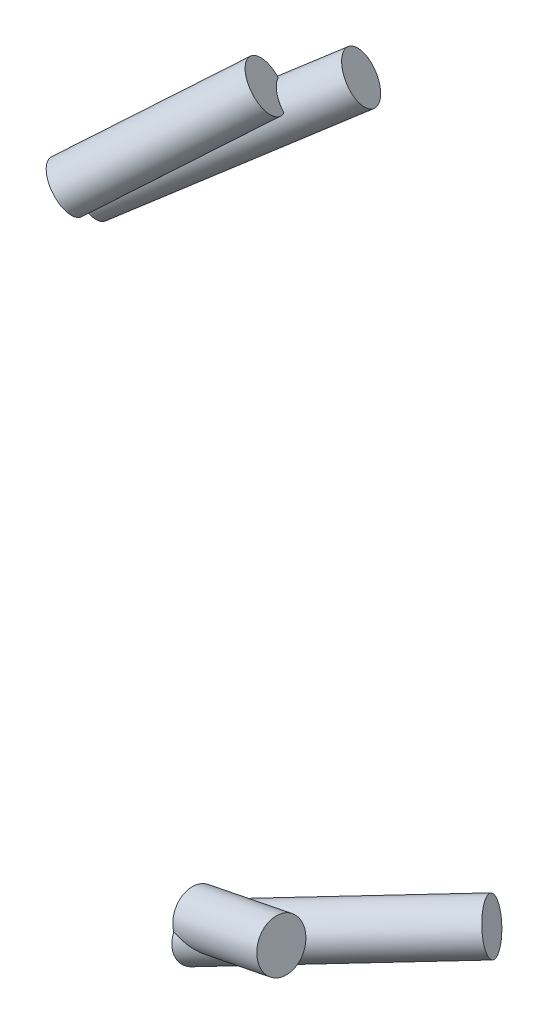
ISO-10303-21;
HEADER;
FILE_DESCRIPTION(('STEP AP214'),'2;1');
FILE_NAME('part.step','',(''),(''),'','','');
FILE_SCHEMA(('AUTOMOTIVE_DESIGN { 1 0 10303 214 1 1 1 1 }'));
ENDSEC;
DATA;
#1=APPLICATION_CONTEXT('core data for automotive mechanical design processes');
#2=APPLICATION_PROTOCOL_DEFINITION('international standard','automotive_design',2000,#1);
#3=PRODUCT_CONTEXT('',#1,'mechanical');
#4=PRODUCT('Part','Part','',(#3));
#5=PRODUCT_RELATED_PRODUCT_CATEGORY('part','',(#4));
#6=PRODUCT_DEFINITION_FORMATION('','',#4);
#7=PRODUCT_DEFINITION_CONTEXT('part definition',#1,'design');
#8=PRODUCT_DEFINITION('design','',#6,#7);
#9=PRODUCT_DEFINITION_SHAPE('','',#8);
#10=(LENGTH_UNIT() NAMED_UNIT(*) SI_UNIT(.MILLI.,.METRE.));
#11=(NAMED_UNIT(*) PLANE_ANGLE_UNIT() SI_UNIT($,.RADIAN.));
#12=(NAMED_UNIT(*) SI_UNIT($,.STERADIAN.) SOLID_ANGLE_UNIT());
#13=UNCERTAINTY_MEASURE_WITH_UNIT(LENGTH_MEASURE(1.E-05),#10,'distance_accuracy_value','');
#14=(GEOMETRIC_REPRESENTATION_CONTEXT(3) GLOBAL_UNCERTAINTY_ASSIGNED_CONTEXT((#13)) GLOBAL_UNIT_ASSIGNED_CONTEXT((#10,
#11,#12)) REPRESENTATION_CONTEXT('',''));
#15=CARTESIAN_POINT('',(0.,0.,0.));
#16=DIRECTION('',(0.,0.,1.));
#17=DIRECTION('',(1.,0.,0.));
#18=AXIS2_PLACEMENT_3D('',#15,#16,#17);
#19=CARTESIAN_POINT('',(205.492137,1315.8651,-290.325886));
#20=DIRECTION('',(0.707634787239325,0.549255984730346,-0.444489449961023));
#21=DIRECTION('',(-0.61315666717658,0.789961329114856,0.));
#22=AXIS2_PLACEMENT_3D('',#19,#20,#21);
#23=PLANE('',#22);
#24=CARTESIAN_POINT('',(205.492137,1315.8651,-290.325886));
#25=DIRECTION('',(0.707634787239325,0.549255984730346,-0.444489449961023));
#26=DIRECTION('',(-0.61315666717658,0.789961329114856,0.));
#27=AXIS2_PLACEMENT_3D('',#24,#25,#26);
#28=CIRCLE('',#27,6.99999999999999);
#29=CARTESIAN_POINT('',(206.194755449757,1319.6769593374,-284.496987673051));
#30=VERTEX_POINT('',#29);
#31=CARTESIAN_POINT('',(202.755485993123,1321.66365056859,-287.517407306817));
#32=VERTEX_POINT('',#31);
#33=EDGE_CURVE('E134',#30,#32,#28,.T.);
#34=ORIENTED_EDGE('',*,*,#33,.F.);
#35=DIRECTION('',(-0.100374852290123,-0.544550619731773,-0.832700133047592));
#36=VECTOR('',#35,1.);
#37=CARTESIAN_POINT('',(206.541272310236,1321.55687215239,-281.622317083341));
#38=LINE('',#37,#36);
#39=CARTESIAN_POINT('',(205.838648344204,1317.74501781426,-287.451218014674));
#40=VERTEX_POINT('',#39);
#41=EDGE_CURVE('E98',#30,#40,#38,.T.);
#42=ORIENTED_EDGE('',*,*,#41,.T.);
#43=CARTESIAN_POINT('',(206.541274841578,1321.55686985828,-281.622315888227));
#44=DIRECTION('',(0.707634787239325,0.549255984730346,-0.444489449961023));
#45=DIRECTION('',(-0.699412537002649,0.633863144367682,-0.330211473598107));
#46=AXIS2_PLACEMENT_3D('',#43,#44,#45);
#47=ELLIPSE('',#46,7.01546166768687,6.99999999999999);
#48=EDGE_CURVE('E91',#32,#40,#47,.F.);
#49=ORIENTED_EDGE('',*,*,#48,.F.);
#50=EDGE_LOOP('',(#34,#42,#49));
#51=FACE_BOUND('',#50,.T.);
#52=ADVANCED_FACE('F77',(#51),#23,.F.);
#53=CARTESIAN_POINT('',(205.492137,1315.8651,-290.325886));
#54=DIRECTION('',(0.707634787239325,0.549255984730346,-0.444489449961022));
#55=DIRECTION('',(-0.61315666717658,0.789961329114855,0.));
#56=AXIS2_PLACEMENT_3D('',#53,#54,#55);
#57=CYLINDRICAL_SURFACE('',#56,6.99999999999999);
#58=CARTESIAN_POINT('',(254.064716,1353.56644,-320.835973));
#59=DIRECTION('',(0.707634787239325,0.549255984730346,-0.444489449961023));
#60=DIRECTION('',(-0.61315666717658,0.789961329114856,0.));
#61=AXIS2_PLACEMENT_3D('',#58,#59,#60);
#62=CIRCLE('',#61,6.99999999999999);
#63=CARTESIAN_POINT('',(249.772619329764,1359.0961693038,-320.835973));
#64=VERTEX_POINT('',#63);
#65=EDGE_CURVE('E129',#64,#64,#62,.T.);
#66=ORIENTED_EDGE('',*,*,#65,.F.);
#67=EDGE_LOOP('',(#66));
#68=FACE_BOUND('',#67,.T.);
#69=CARTESIAN_POINT('',(205.492137371155,1315.86510028809,-290.325886233135));
#70=DIRECTION('',(0.659665472961161,0.590105635574943,-0.465421102492807));
#71=DIRECTION('',(0.744826391054093,-0.596020101517078,0.299989476110258));
#72=AXIS2_PLACEMENT_3D('',#69,#70,#71);
#73=ELLIPSE('',#72,7.01546166768687,6.99999999999999);
#74=CARTESIAN_POINT('',(209.489651927909,1315.93474913126,-284.571693973106));
#75=VERTEX_POINT('',#74);
#76=EDGE_CURVE('E128',#30,#75,#73,.T.);
#77=ORIENTED_EDGE('',*,*,#76,.F.);
#78=ORIENTED_EDGE('',*,*,#33,.T.);
#79=CARTESIAN_POINT('',(202.755485993123,1321.66365056859,-287.517407306817));
#80=CARTESIAN_POINT('',(204.344051653858,1322.9554182,-288.636513844986));
#81=CARTESIAN_POINT('',(205.935139799472,1324.24504653722,-289.754508119233));
#82=CARTESIAN_POINT('',(209.122364978992,1326.82055794119,-291.987525919635));
#83=CARTESIAN_POINT('',(210.718501925398,1328.10644107211,-293.102549496665));
#84=CARTESIAN_POINT('',(214.476326811834,1331.12526901684,-295.719160696513));
#85=CARTESIAN_POINT('',(216.640119129513,1332.85690880127,-297.21923280162));
#86=CARTESIAN_POINT('',(220.976925093919,1336.31585293877,-300.211027993928));
#87=CARTESIAN_POINT('',(223.149938748426,1338.04315728817,-301.702751074083));
#88=CARTESIAN_POINT('',(227.505065974179,1341.4949660686,-304.676433931541));
#89=CARTESIAN_POINT('',(229.687179964788,1343.2194703654,-306.158393250607));
#90=CARTESIAN_POINT('',(234.060106595367,1346.66697851317,-309.111186406112));
#91=CARTESIAN_POINT('',(236.250919243103,1348.38998236281,-310.582020232617));
#92=CARTESIAN_POINT('',(238.445928956538,1350.11292453637,-312.046644000828));
#93=B_SPLINE_CURVE_WITH_KNOTS('',3,(#79,#80,#81,#82,#83,#84,#85,#86,#87,#88,#89,#90,#91,#92),
.UNSPECIFIED.,.F.,.F.,(4,2,2,2,2,2,4),(0.,7.00009902719293,14.0000773926028,23.45399620348,
32.9079229918954,42.3622903594851,51.8166661691714),.UNSPECIFIED.);
#94=CARTESIAN_POINT('',(238.445928956538,1350.11292453637,-312.046644000827));
#95=VERTEX_POINT('',#94);
#96=EDGE_CURVE('E106',#32,#95,#93,.T.);
#97=ORIENTED_EDGE('',*,*,#96,.T.);
#98=CARTESIAN_POINT('',(242.411281942108,1344.52121142393,-313.516055172391));
#99=DIRECTION('',(0.659665472961161,0.590105635574943,-0.465421102492807));
#100=DIRECTION('',(0.744826391054093,-0.596020101517078,0.299989476110258));
#101=AXIS2_PLACEMENT_3D('',#98,#99,#100);
#102=ELLIPSE('',#101,7.01546166768687,6.99999999999999);
#103=CARTESIAN_POINT('',(244.840775851869,1346.69311370678,-307.318860823841));
#104=VERTEX_POINT('',#103);
#105=EDGE_CURVE('E125',#95,#104,#102,.T.);
#106=ORIENTED_EDGE('',*,*,#105,.T.);
#107=CARTESIAN_POINT('',(244.840775851869,1346.69311370678,-307.318860823841));
#108=CARTESIAN_POINT('',(243.275255432891,1345.30982848157,-306.279546868999));
#109=CARTESIAN_POINT('',(241.707444382586,1343.92658006895,-305.243637966962));
#110=CARTESIAN_POINT('',(238.567113228578,1341.16070101781,-303.178125049771));
#111=CARTESIAN_POINT('',(236.994593100818,1339.77807038247,-302.148521066909));
#112=CARTESIAN_POINT('',(233.285344047544,1336.52310767955,-299.730457801903));
#113=CARTESIAN_POINT('',(231.146598764442,1334.65126752423,-298.344428733746));
#114=CARTESIAN_POINT('',(226.85998031605,1330.91119335423,-295.581641306999));
#115=CARTESIAN_POINT('',(224.71210713497,1329.0429593458,-294.204882964456));
#116=CARTESIAN_POINT('',(220.407062479439,1325.31156744327,-291.459068436609));
#117=CARTESIAN_POINT('',(218.249891030535,1323.44840953524,-290.090012230165));
#118=CARTESIAN_POINT('',(213.926205405008,1319.7285853176,-287.357857073473));
#119=CARTESIAN_POINT('',(211.759691246689,1317.87191899529,-285.994758111563));
#120=CARTESIAN_POINT('',(209.555598424173,1315.99102023187,-284.613031839746));
#121=CARTESIAN_POINT('',(209.522625707179,1315.96288423017,-284.592362672553));
#122=CARTESIAN_POINT('',(209.489651927909,1315.93474913126,-284.571693973106));
#123=B_SPLINE_CURVE_WITH_KNOTS('',3,(#107,#108,#109,#110,#111,#112,#113,#114,#115,#116,#117,
#118,#119,#120,#121,#122),.UNSPECIFIED.,.F.,.F.,(4,2,2,2,2,2,2,4),(0.,7.00003313117314,
14.0001020848096,23.486473953231,32.9728622390189,42.4592244770255,51.9455681375453,
52.0896321585263),.UNSPECIFIED.);
#124=EDGE_CURVE('E13',#104,#75,#123,.T.);
#125=ORIENTED_EDGE('',*,*,#124,.T.);
#126=EDGE_LOOP('',(#77,#78,#97,#106,#125));
#127=FACE_BOUND('',#126,.T.);
#128=ADVANCED_FACE('F132',(#68,#127),#57,.T.);
#129=CARTESIAN_POINT('',(254.064716,1353.56644,-320.835973));
#130=DIRECTION('',(0.707634787239325,0.549255984730346,-0.444489449961023));
#131=DIRECTION('',(-0.61315666717658,0.789961329114856,0.));
#132=AXIS2_PLACEMENT_3D('',#129,#130,#131);
#133=PLANE('',#132);
#134=ORIENTED_EDGE('',*,*,#65,.T.);
#135=EDGE_LOOP('',(#134));
#136=FACE_BOUND('',#135,.T.);
#137=ADVANCED_FACE('F146',(#136),#133,.T.);
#138=CARTESIAN_POINT('',(206.541275,1321.55687,-281.622316));
#139=DIRECTION('',(0.659665472961161,0.590105635574943,-0.465421102492807));
#140=DIRECTION('',(-0.666718699708654,0.745309449462975,0.));
#141=AXIS2_PLACEMENT_3D('',#138,#139,#140);
#142=PLANE('',#141);
#143=ORIENTED_EDGE('',*,*,#41,.F.);
#144=ORIENTED_EDGE('',*,*,#76,.T.);
#145=CARTESIAN_POINT('',(206.541275,1321.55687,-281.622316));
#146=DIRECTION('',(0.659665472961161,0.590105635574943,-0.465421102492807));
#147=DIRECTION('',(-0.666718699708654,0.745309449462975,0.));
#148=AXIS2_PLACEMENT_3D('',#145,#146,#147);
#149=CIRCLE('',#148,6.99999999999999);
#150=EDGE_CURVE('E123',#40,#75,#149,.T.);
#151=ORIENTED_EDGE('',*,*,#150,.F.);
#152=EDGE_LOOP('',(#143,#144,#151));
#153=FACE_BOUND('',#152,.T.);
#154=ADVANCED_FACE('F79',(#153),#142,.F.);
#155=CARTESIAN_POINT('',(240.881884,1352.27636,-305.851027));
#156=DIRECTION('',(0.659665472961161,0.590105635574943,-0.465421102492807));
#157=DIRECTION('',(-0.666718699708654,0.745309449462975,0.));
#158=AXIS2_PLACEMENT_3D('',#155,#156,#157);
#159=PLANE('',#158);
#160=ORIENTED_EDGE('',*,*,#105,.F.);
#161=CARTESIAN_POINT('',(240.881884,1352.27636,-305.851027));
#162=DIRECTION('',(0.659665472961161,0.590105635574943,-0.465421102492807));
#163=DIRECTION('',(-0.666718699708654,0.745309449462975,0.));
#164=AXIS2_PLACEMENT_3D('',#161,#162,#163);
#165=CIRCLE('',#164,6.99999999999999);
#166=EDGE_CURVE('E117',#95,#104,#165,.T.);
#167=ORIENTED_EDGE('',*,*,#166,.T.);
#168=EDGE_LOOP('',(#160,#167));
#169=FACE_BOUND('',#168,.T.);
#170=ADVANCED_FACE('F126',(#169),#159,.T.);
#171=CARTESIAN_POINT('',(206.541275,1321.55687,-281.622316));
#172=DIRECTION('',(0.659665472961161,0.590105635574946,-0.465421102492804));
#173=DIRECTION('',(-0.666718699708655,0.745309449462973,0.));
#174=AXIS2_PLACEMENT_3D('',#171,#172,#173);
#175=CYLINDRICAL_SURFACE('',#174,6.99999999999999);
#176=ORIENTED_EDGE('',*,*,#124,.F.);
#177=ORIENTED_EDGE('',*,*,#166,.F.);
#178=ORIENTED_EDGE('',*,*,#96,.F.);
#179=ORIENTED_EDGE('',*,*,#48,.T.);
#180=ORIENTED_EDGE('',*,*,#150,.T.);
#181=EDGE_LOOP('',(#176,#177,#178,#179,#180));
#182=FACE_BOUND('',#181,.T.);
#183=ADVANCED_FACE('F119',(#182),#175,.T.);
#184=CLOSED_SHELL('',(#52,#128,#137,#154,#170,#183));
#185=MANIFOLD_SOLID_BREP('B2',#184);
#186=CARTESIAN_POINT('',(263.769266,1173.5341,-262.913084));
#187=DIRECTION('',(0.978535289011895,0.205659936457177,0.0131407265719176));
#188=DIRECTION('',(-0.205677695301845,0.978619786053461,0.));
#189=AXIS2_PLACEMENT_3D('',#186,#187,#188);
#190=PLANE('',#189);
#191=CARTESIAN_POINT('',(263.769266,1173.5341,-262.913084));
#192=DIRECTION('',(0.978535289011895,0.205659936457177,0.0131407265719176));
#193=DIRECTION('',(-0.205677695301845,0.978619786053461,0.));
#194=AXIS2_PLACEMENT_3D('',#191,#192,#193);
#195=CIRCLE('',#194,7.);
#196=CARTESIAN_POINT('',(263.892967671315,1173.39263093602,-269.910561002495));
#197=VERTEX_POINT('',#196);
#198=CARTESIAN_POINT('',(263.784396639198,1173.01606763889,-255.932295109295));
#199=VERTEX_POINT('',#198);
#200=EDGE_CURVE('E245',#197,#199,#195,.T.);
#201=ORIENTED_EDGE('',*,*,#200,.F.);
#202=CARTESIAN_POINT('',(264.595494325762,1169.60923007361,-263.012399199072));
#203=DIRECTION('',(0.978535289011895,0.205659936457177,0.0131407265719176));
#204=DIRECTION('',(0.00776404643263399,0.0269287816070713,-0.999607203007337));
#205=AXIS2_PLACEMENT_3D('',#202,#203,#204);
#206=ELLIPSE('',#205,8.2151219886604,6.99999999999999);
#207=EDGE_CURVE('E251',#197,#199,#206,.F.);
#208=ORIENTED_EDGE('',*,*,#207,.T.);
#209=EDGE_LOOP('',(#201,#208));
#210=FACE_BOUND('',#209,.T.);
#211=ADVANCED_FACE('F226',(#210),#190,.F.);
#212=CARTESIAN_POINT('',(288.828884,1178.80091,-262.576559));
#213=DIRECTION('',(0.978535289011895,0.205659936457177,0.0131407265719176));
#214=DIRECTION('',(-0.205677695301845,0.978619786053461,0.));
#215=AXIS2_PLACEMENT_3D('',#212,#213,#214);
#216=PLANE('',#215);
#217=CARTESIAN_POINT('',(288.828884,1178.80091,-262.576559));
#218=DIRECTION('',(0.978535289011895,0.205659936457177,0.0131407265719176));
#219=DIRECTION('',(-0.205677695301845,0.978619786053461,0.));
#220=AXIS2_PLACEMENT_3D('',#217,#218,#219);
#221=CIRCLE('',#220,7.);
#222=CARTESIAN_POINT('',(287.389140132887,1185.65124850237,-262.576559));
#223=VERTEX_POINT('',#222);
#224=EDGE_CURVE('E239',#223,#223,#221,.T.);
#225=ORIENTED_EDGE('',*,*,#224,.T.);
#226=EDGE_LOOP('',(#225));
#227=FACE_BOUND('',#226,.T.);
#228=ADVANCED_FACE('F263',(#227),#216,.T.);
#229=CARTESIAN_POINT('',(263.769266,1173.5341,-262.913084));
#230=DIRECTION('',(0.978535289011896,0.205659936457169,0.0131407265719198));
#231=DIRECTION('',(-0.205677695301836,0.978619786053463,0.));
#232=AXIS2_PLACEMENT_3D('',#229,#230,#231);
#233=CYLINDRICAL_SURFACE('',#232,7.);
#234=CARTESIAN_POINT('',(263.892967671315,1173.39263093602,-269.910561002495));
#235=CARTESIAN_POINT('',(264.01303289985,1173.53775551645,-269.911384315187));
#236=CARTESIAN_POINT('',(264.135228474861,1173.6811301385,-269.909159091962));
#237=CARTESIAN_POINT('',(264.384102532944,1173.96373870328,-269.899347993202));
#238=CARTESIAN_POINT('',(264.510780888428,1174.10297276365,-269.891762270119));
#239=CARTESIAN_POINT('',(264.768775161019,1174.37658890148,-269.871972258563));
#240=CARTESIAN_POINT('',(264.900088363337,1174.51097372898,-269.859770634374));
#241=CARTESIAN_POINT('',(265.167517332391,1174.77443905111,-269.83154987536));
#242=CARTESIAN_POINT('',(265.303633057747,1174.90351959142,-269.815530773421));
#243=CARTESIAN_POINT('',(265.716246540994,1175.27936165003,-269.763360244394));
#244=CARTESIAN_POINT('',(265.999878266658,1175.5177868815,-269.722838494463));
#245=CARTESIAN_POINT('',(266.585408767102,1175.96978455776,-269.636342656264));
#246=CARTESIAN_POINT('',(266.887306659902,1176.18335820106,-269.590368831146));
#247=CARTESIAN_POINT('',(267.511634520301,1176.58767756674,-269.497893186451));
#248=CARTESIAN_POINT('',(267.834281406442,1176.77808813873,-269.451392326715));
#249=CARTESIAN_POINT('',(268.493861804688,1177.13348464596,-269.362882376443));
#250=CARTESIAN_POINT('',(268.830796846449,1177.29846785021,-269.320873768539));
#251=CARTESIAN_POINT('',(269.516791463237,1177.60499386211,-269.244151693347));
#252=CARTESIAN_POINT('',(269.865875629476,1177.74648532712,-269.209454161495));
#253=CARTESIAN_POINT('',(270.572795689913,1178.00776461022,-269.148952668689));
#254=CARTESIAN_POINT('',(270.930632091163,1178.12755116745,-269.123149224319));
#255=CARTESIAN_POINT('',(271.610253276652,1178.33467219055,-269.083315890128));
#256=CARTESIAN_POINT('',(271.931327267607,1178.42416655151,-269.06825808758));
#257=CARTESIAN_POINT('',(272.577291488548,1178.58936299817,-269.045154050468));
#258=CARTESIAN_POINT('',(272.902182343858,1178.66506278938,-269.037108981515));
#259=CARTESIAN_POINT('',(273.554995500419,1178.80386216429,-269.027551204914));
#260=CARTESIAN_POINT('',(273.882920055959,1178.86695143128,-269.026043825073));
#261=CARTESIAN_POINT('',(274.54076129363,1178.98134690747,-269.028935105627));
#262=CARTESIAN_POINT('',(274.870677876514,1179.0326536988,-269.033333474164));
#263=CARTESIAN_POINT('',(275.533100323323,1179.12427098665,-269.047343590536));
#264=CARTESIAN_POINT('',(275.865611215272,1179.16454207382,-269.056973665397));
#265=CARTESIAN_POINT('',(276.531617670417,1179.23419438743,-269.080702984453));
#266=CARTESIAN_POINT('',(276.865113265811,1179.26357525372,-269.094802376427));
#267=CARTESIAN_POINT('',(277.532493942276,1179.31148483094,-269.126691348896));
#268=CARTESIAN_POINT('',(277.866378646531,1179.33002035469,-269.144478603217));
#269=CARTESIAN_POINT('',(278.53438625458,1179.35600935341,-269.182966301111));
#270=CARTESIAN_POINT('',(278.868509137605,1179.36346369868,-269.203666515765));
#271=CARTESIAN_POINT('',(279.554876423531,1179.36677000395,-269.248353614689));
#272=CARTESIAN_POINT('',(279.907116965806,1179.36196813447,-269.27245808432));
#273=CARTESIAN_POINT('',(280.61108038664,1179.33811487128,-269.321967674769));
#274=CARTESIAN_POINT('',(280.96280320721,1179.31906198741,-269.347372931347));
#275=CARTESIAN_POINT('',(281.663385192433,1179.26482260658,-269.398141439516));
#276=CARTESIAN_POINT('',(282.012250062677,1179.22971175212,-269.42350433461));
#277=CARTESIAN_POINT('',(282.707538923344,1179.14032063358,-269.472751033208));
#278=CARTESIAN_POINT('',(283.053963930089,1179.08604889976,-269.496635489347));
#279=CARTESIAN_POINT('',(283.685729761407,1178.9643650047,-269.537083222565));
#280=CARTESIAN_POINT('',(283.971713777862,1178.90060105578,-269.554204194689));
#281=CARTESIAN_POINT('',(284.39725091847,1178.7887546838,-269.576455653971));
#282=CARTESIAN_POINT('',(284.53881876779,1178.74867058949,-269.583311966436));
#283=CARTESIAN_POINT('',(284.820096280095,1178.66227609869,-269.595484880207));
#284=CARTESIAN_POINT('',(284.959806338883,1178.61596705256,-269.600801814658));
#285=CARTESIAN_POINT('',(285.238528237365,1178.51543787313,-269.609480767567));
#286=CARTESIAN_POINT('',(285.37750651949,1178.46112138543,-269.612816055667));
#287=CARTESIAN_POINT('',(285.651865712756,1178.34363504473,-269.616755004091));
#288=CARTESIAN_POINT('',(285.787244318664,1178.28045967356,-269.617356953967));
#289=CARTESIAN_POINT('',(286.051824053307,1178.14394133476,-269.614915310181));
#290=CARTESIAN_POINT('',(286.181056510104,1178.07065958944,-269.61189288216));
#291=CARTESIAN_POINT('',(286.431303504561,1177.9116682414,-269.601003425002));
#292=CARTESIAN_POINT('',(286.552332247775,1177.82598097138,-269.59314502077));
#293=CARTESIAN_POINT('',(286.76099295989,1177.65692464374,-269.572972609391));
#294=CARTESIAN_POINT('',(286.850683262358,1177.57600131937,-269.561737244895));
#295=CARTESIAN_POINT('',(287.018300412433,1177.40343429819,-269.533871628481));
#296=CARTESIAN_POINT('',(287.096232026114,1177.31179497172,-269.517243571002));
#297=CARTESIAN_POINT('',(287.236739684122,1177.11675428759,-269.477379985797));
#298=CARTESIAN_POINT('',(287.299121925017,1177.01322591861,-269.454068170787));
#299=CARTESIAN_POINT('',(287.402582229517,1176.79768130394,-269.400541587741));
#300=CARTESIAN_POINT('',(287.443690867396,1176.68567750612,-269.370336816748));
#301=CARTESIAN_POINT('',(287.499063925894,1176.47021668922,-269.307432400538));
#302=CARTESIAN_POINT('',(287.515806393733,1176.36719544398,-269.275384355709));
#303=CARTESIAN_POINT('',(287.531405137446,1176.16107686995,-269.207417032772));
#304=CARTESIAN_POINT('',(287.530244042565,1176.05797956434,-269.171494028574));
#305=CARTESIAN_POINT('',(287.509051386044,1175.81773680862,-269.083571101001));
#306=CARTESIAN_POINT('',(287.48240822568,1175.68162603622,-269.030422235659));
#307=CARTESIAN_POINT('',(287.407281386891,1175.41679571572,-268.921295800847));
#308=CARTESIAN_POINT('',(287.358743723286,1175.28809532924,-268.865311544902));
#309=CARTESIAN_POINT('',(287.252021691185,1175.05249474851,-268.758134921187));
#310=CARTESIAN_POINT('',(287.195488508536,1174.94475468881,-268.707093871254));
#311=CARTESIAN_POINT('',(287.072828956516,1174.73518118468,-268.604286365187));
#312=CARTESIAN_POINT('',(287.006694428645,1174.63335286766,-268.5525193263));
#313=CARTESIAN_POINT('',(286.866930338453,1174.43493580213,-268.448457142227));
#314=CARTESIAN_POINT('',(286.793285059564,1174.33835871693,-268.396161104813));
#315=CARTESIAN_POINT('',(286.640231012053,1174.15014056412,-268.291306420726));
#316=CARTESIAN_POINT('',(286.560824181349,1174.05849785471,-268.238747867839));
#317=CARTESIAN_POINT('',(286.358503275148,1173.83700608792,-268.108351042771));
#318=CARTESIAN_POINT('',(286.232865545818,1173.70972584924,-268.03038358846));
#319=CARTESIAN_POINT('',(285.974099359825,1173.46324113809,-267.874029477469));
#320=CARTESIAN_POINT('',(285.84096725467,1173.34404066243,-267.79564263372));
#321=CARTESIAN_POINT('',(285.568754650417,1173.11249305644,-267.638336531606));
#322=CARTESIAN_POINT('',(285.429664819917,1173.00015739964,-267.559416614214));
#323=CARTESIAN_POINT('',(285.146936902713,1172.78168317391,-267.401107980897));
#324=CARTESIAN_POINT('',(285.003298042925,1172.67554566715,-267.321719187175));
#325=CARTESIAN_POINT('',(284.711437393127,1172.46815597244,-267.161902050758));
#326=CARTESIAN_POINT('',(284.563192028897,1172.3669396876,-267.081470305801));
#327=CARTESIAN_POINT('',(284.263669602566,1172.16960149439,-266.919990713965));
#328=CARTESIAN_POINT('',(284.11239228821,1172.07348001235,-266.838942816173));
#329=CARTESIAN_POINT('',(283.655127721755,1171.79230872707,-266.594917152747));
#330=CARTESIAN_POINT('',(283.345395966687,1171.61423409875,-266.430888302009));
#331=CARTESIAN_POINT('',(282.712759195513,1171.27107989782,-266.096082897832));
#332=CARTESIAN_POINT('',(282.389714756435,1171.10632787672,-265.925237040333));
#333=CARTESIAN_POINT('',(281.73836929505,1170.79245829822,-265.579125315574));
#334=CARTESIAN_POINT('',(281.410067398401,1170.64334337314,-265.403858710276));
#335=CARTESIAN_POINT('',(280.74934616467,1170.36000850447,-265.047878337927));
#336=CARTESIAN_POINT('',(280.416921772049,1170.22580939369,-264.867157389597));
#337=CARTESIAN_POINT('',(279.74965313705,1169.97262771282,-264.49967139901));
#338=CARTESIAN_POINT('',(279.414809067111,1169.85364406948,-264.312906784218));
#339=CARTESIAN_POINT('',(278.74557300166,1169.6321768209,-263.933526242185));
#340=CARTESIAN_POINT('',(278.411188472676,1169.52960689769,-263.740947714042));
#341=CARTESIAN_POINT('',(277.742007124758,1169.34146958647,-263.348223286363));
#342=CARTESIAN_POINT('',(277.407210272305,1169.25590368716,-263.148076726072));
#343=CARTESIAN_POINT('',(276.738690851471,1169.10382238439,-262.74000817591));
#344=CARTESIAN_POINT('',(276.404967425831,1169.03727882023,-262.53209820037));
#345=CARTESIAN_POINT('',(275.739153730203,1168.92564009628,-262.108191825054));
#346=CARTESIAN_POINT('',(275.407063024759,1168.88053887193,-261.892197730386));
#347=CARTESIAN_POINT('',(274.726759289202,1168.81302027847,-261.440351705105));
#348=CARTESIAN_POINT('',(274.378688123723,1168.7920189483,-261.204065770926));
#349=CARTESIAN_POINT('',(273.68631449596,1168.78140014343,-260.725301493854));
#350=CARTESIAN_POINT('',(273.342011667928,1168.79177959535,-260.482823759678));
#351=CARTESIAN_POINT('',(272.658967630403,1168.84760632418,-259.996605920002));
#352=CARTESIAN_POINT('',(272.320210181196,1168.89291926811,-259.752874194815));
#353=CARTESIAN_POINT('',(271.815263698057,1168.98883328426,-259.390378544507));
#354=CARTESIAN_POINT('',(271.647457493417,1169.02546885501,-259.270047696264));
#355=CARTESIAN_POINT('',(271.312764119397,1169.10813388842,-259.031364101515));
#356=CARTESIAN_POINT('',(271.145876846104,1169.15416226556,-258.913011128136));
#357=CARTESIAN_POINT('',(270.811561068123,1169.25594327261,-258.678387763836));
#358=CARTESIAN_POINT('',(270.644138356785,1169.31176834309,-258.562140552939));
#359=CARTESIAN_POINT('',(270.309823356119,1169.43262122436,-258.333781555174));
#360=CARTESIAN_POINT('',(270.142931006609,1169.49764794989,-258.221669282581));
#361=CARTESIAN_POINT('',(269.809331010879,1169.63644972845,-258.00264692056));
#362=CARTESIAN_POINT('',(269.642623394982,1169.71022604977,-257.895737588501));
#363=CARTESIAN_POINT('',(269.309065051998,1169.86584696002,-257.688199495376));
#364=CARTESIAN_POINT('',(269.142214325415,1169.94769152063,-257.587570712275));
#365=CARTESIAN_POINT('',(268.807563316849,1170.11880124909,-257.393332627634));
#366=CARTESIAN_POINT('',(268.639761703293,1170.20808448766,-257.299741536694));
#367=CARTESIAN_POINT('',(268.303214513299,1170.39285461515,-257.120729691958));
#368=CARTESIAN_POINT('',(268.134468920386,1170.48834161266,-257.035309081243));
#369=CARTESIAN_POINT('',(267.795664655648,1170.68431024991,-256.873383896949));
#370=CARTESIAN_POINT('',(267.625606298469,1170.78479072237,-256.79687725352));
#371=CARTESIAN_POINT('',(267.283763773753,1170.98945245797,-256.653312172515));
#372=CARTESIAN_POINT('',(267.111979720579,1171.09363347701,-256.586253113208));
#373=CARTESIAN_POINT('',(266.68779420423,1171.35217216558,-256.433719678887));
#374=CARTESIAN_POINT('',(266.434203821868,1171.50783433543,-256.353708917829));
#375=CARTESIAN_POINT('',(265.921616848616,1171.81961225904,-256.214826092299));
#376=CARTESIAN_POINT('',(265.662621116552,1171.9757279374,-256.15595069639));
#377=CARTESIAN_POINT('',(265.269169355311,1172.20710408401,-256.082952954692));
#378=CARTESIAN_POINT('',(265.136983756241,1172.28388000138,-256.061151094221));
#379=CARTESIAN_POINT('',(264.870996077916,1172.43588368118,-256.022532536));
#380=CARTESIAN_POINT('',(264.737193998939,1172.51111144389,-256.005715837389));
#381=CARTESIAN_POINT('',(264.467879991599,1172.65951002076,-255.976856594892));
#382=CARTESIAN_POINT('',(264.332367437035,1172.73268004797,-255.964815855053));
#383=CARTESIAN_POINT('',(264.059654112949,1172.87643648464,-255.945242736651));
#384=CARTESIAN_POINT('',(263.922453316034,1172.9470228521,-255.937710431344));
#385=CARTESIAN_POINT('',(263.784396639198,1173.01606763889,-255.932295109295));
#386=B_SPLINE_CURVE_WITH_KNOTS('',3,(#234,#235,#236,#237,#238,#239,#240,#241,#242,#243,#244,
#245,#246,#247,#248,#249,#250,#251,#252,#253,#254,#255,#256,#257,#258,#259,#260,#261,#262,#263,
#264,#265,#266,#267,#268,#269,#270,#271,#272,#273,#274,#275,#276,#277,#278,#279,#280,#281,#282,
#283,#284,#285,#286,#287,#288,#289,#290,#291,#292,#293,#294,#295,#296,#297,#298,#299,#300,#301,
#302,#303,#304,#305,#306,#307,#308,#309,#310,#311,#312,#313,#314,#315,#316,#317,#318,#319,#320,
#321,#322,#323,#324,#325,#326,#327,#328,#329,#330,#331,#332,#333,#334,#335,#336,#337,#338,#339,
#340,#341,#342,#343,#344,#345,#346,#347,#348,#349,#350,#351,#352,#353,#354,#355,#356,#357,#358,
#359,#360,#361,#362,#363,#364,#365,#366,#367,#368,#369,#370,#371,#372,#373,#374,#375,#376,#377,
#378,#379,#380,#381,#382,#383,#384,#385),.UNSPECIFIED.,.F.,.F.,(4,2,2,2,2,2,2,2,2,2,2,2,2,2,2,2,
2,2,2,2,2,2,2,2,2,2,2,2,2,2,2,2,2,2,2,2,2,2,2,2,2,2,2,2,2,2,2,2,2,2,2,2,2,2,2,2,2,2,2,2,2,2,2,2,
2,2,2,2,2,2,2,2,2,2,2,4),(0.,0.565014288210935,1.13001250803867,1.6946851087396,
2.25935284532438,3.37611819105044,4.49282965676159,5.62414855928311,6.75558888544355,
7.88947038926255,9.02341773976709,10.0239734868547,11.0246955082978,12.0262329025859,
13.027720803246,14.0327398214668,15.0377920742552,16.042212293176,17.0465536221394,
18.1055796331324,19.1647163972425,20.2189145899074,21.272644053712,22.1524235360215,
22.5941829620788,23.0358467129161,23.4833402235577,23.9311137247134,24.3762850032107,
24.8206646160477,25.1837168673285,25.5466215673744,25.9138455979955,26.2805403807488,
26.6064318384886,26.9326395090585,27.3757160050941,27.8198910157451,28.215146859221,
28.6107405487849,29.007179715336,29.4034861507436,29.988361703698,30.5735244968163,
31.159639963494,31.7458555776961,32.3358501477474,32.9258940102271,34.1047343345211,
35.3069413913589,36.509350501753,37.7134184459483,38.9174014123012,40.1148284622942,
41.3123603005477,42.508110019947,43.7035213424885,44.9660612277462,46.2284774666772,
47.486063286506,48.1150251832917,48.7439144326384,49.3776665593547,50.0113440013806,
50.6451134108452,51.2788805966657,51.914234977711,52.5496004829076,53.1848181590061,
53.8199940128898,54.7435729335819,55.6670062122967,56.1301601625817,56.5933140329636,
57.0566426864534,57.519978868171),.UNSPECIFIED.);
#387=EDGE_CURVE('E75',#197,#199,#386,.T.);
#388=ORIENTED_EDGE('',*,*,#387,.F.);
#389=ORIENTED_EDGE('',*,*,#200,.T.);
#390=EDGE_LOOP('',(#388,#389));
#391=FACE_BOUND('',#390,.T.);
#392=ORIENTED_EDGE('',*,*,#224,.F.);
#393=EDGE_LOOP('',(#392));
#394=FACE_BOUND('',#393,.T.);
#395=ADVANCED_FACE('F246',(#391,#394),#233,.T.);
#396=CARTESIAN_POINT('',(317.831115999958,1181.63909000002,-295.543440999975));
#397=DIRECTION('',(0.837861060811386,0.189334713906637,-0.511997274295392));
#398=DIRECTION('',(-0.521428557990094,0.,-0.853294942509547));
#399=AXIS2_PLACEMENT_3D('',#396,#397,#398);
#400=PLANE('',#399);
#401=CARTESIAN_POINT('',(317.831115999958,1181.63909000002,-295.543440999975));
#402=DIRECTION('',(0.837861060811386,0.189334713906637,-0.511997274295392));
#403=DIRECTION('',(-0.521428557990094,0.,-0.853294942509547));
#404=AXIS2_PLACEMENT_3D('',#401,#402,#403);
#405=CIRCLE('',#404,6.99999999999999);
#406=CARTESIAN_POINT('',(314.181116094027,1181.63909000002,-301.516505597542));
#407=VERTEX_POINT('',#406);
#408=EDGE_CURVE('E256',#407,#407,#405,.T.);
#409=ORIENTED_EDGE('',*,*,#408,.T.);
#410=EDGE_LOOP('',(#409));
#411=FACE_BOUND('',#410,.T.);
#412=ADVANCED_FACE('F265',(#411),#400,.T.);
#413=CARTESIAN_POINT('',(259.965349209978,1168.56293822184,-260.183025941676));
#414=DIRECTION('',(0.837861060811385,0.189334713906647,-0.51199727429539));
#415=DIRECTION('',(-0.521428557990093,0.,-0.853294942509548));
#416=AXIS2_PLACEMENT_3D('',#413,#414,#415);
#417=CYLINDRICAL_SURFACE('',#416,6.99999999999999);
#418=ORIENTED_EDGE('',*,*,#207,.F.);
#419=ORIENTED_EDGE('',*,*,#387,.T.);
#420=EDGE_LOOP('',(#418,#419));
#421=FACE_BOUND('',#420,.T.);
#422=ORIENTED_EDGE('',*,*,#408,.F.);
#423=EDGE_LOOP('',(#422));
#424=FACE_BOUND('',#423,.T.);
#425=ADVANCED_FACE('F254',(#421,#424),#417,.T.);
#426=CLOSED_SHELL('',(#211,#228,#395,#412,#425));
#427=MANIFOLD_SOLID_BREP('B7',#426);
#428=ADVANCED_BREP_SHAPE_REPRESENTATION('',(#18,#185,#427),#14);
#429=SHAPE_DEFINITION_REPRESENTATION(#9,#428);
ENDSEC;
END-ISO-10303-21;
